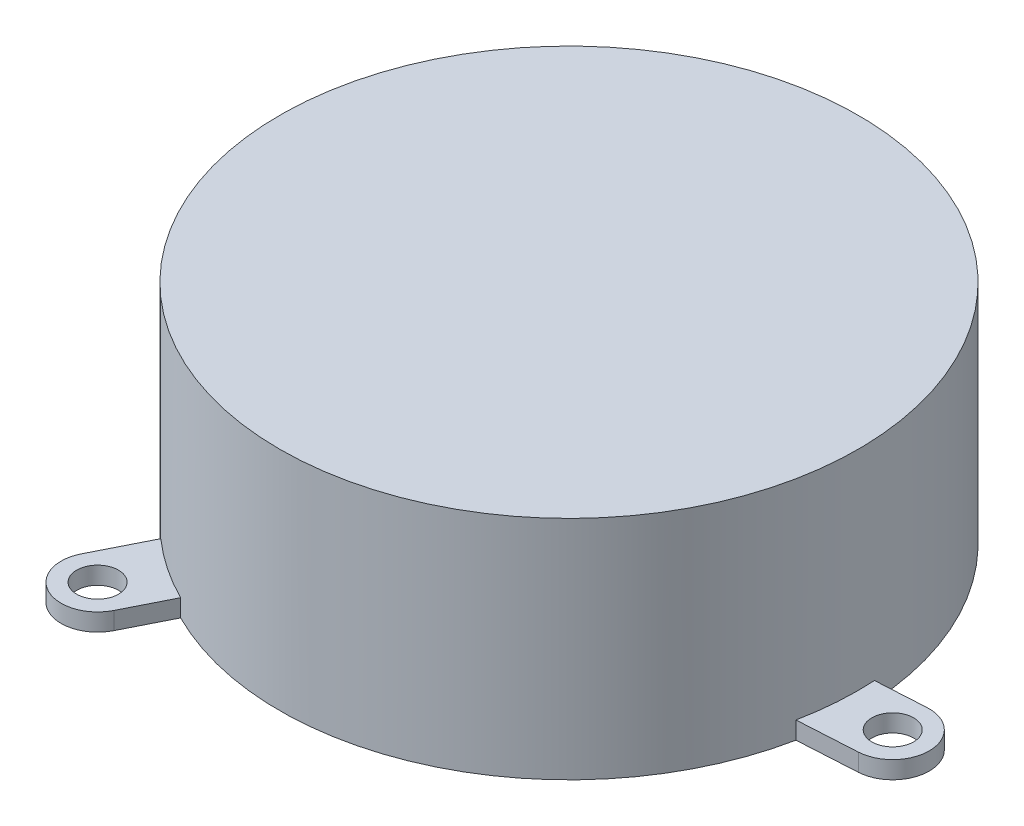
ISO-10303-21;
HEADER;
FILE_DESCRIPTION(('STEP AP214'),'2;1');
FILE_NAME('part.step','',(''),(''),'','','');
FILE_SCHEMA(('AUTOMOTIVE_DESIGN { 1 0 10303 214 1 1 1 1 }'));
ENDSEC;
DATA;
#1=APPLICATION_CONTEXT('core data for automotive mechanical design processes');
#2=APPLICATION_PROTOCOL_DEFINITION('international standard','automotive_design',2000,#1);
#3=PRODUCT_CONTEXT('',#1,'mechanical');
#4=PRODUCT('Part','Part','',(#3));
#5=PRODUCT_RELATED_PRODUCT_CATEGORY('part','',(#4));
#6=PRODUCT_DEFINITION_FORMATION('','',#4);
#7=PRODUCT_DEFINITION_CONTEXT('part definition',#1,'design');
#8=PRODUCT_DEFINITION('design','',#6,#7);
#9=PRODUCT_DEFINITION_SHAPE('','',#8);
#10=(LENGTH_UNIT() NAMED_UNIT(*) SI_UNIT(.MILLI.,.METRE.));
#11=(NAMED_UNIT(*) PLANE_ANGLE_UNIT() SI_UNIT($,.RADIAN.));
#12=(NAMED_UNIT(*) SI_UNIT($,.STERADIAN.) SOLID_ANGLE_UNIT());
#13=UNCERTAINTY_MEASURE_WITH_UNIT(LENGTH_MEASURE(1.E-05),#10,'distance_accuracy_value','');
#14=(GEOMETRIC_REPRESENTATION_CONTEXT(3) GLOBAL_UNCERTAINTY_ASSIGNED_CONTEXT((#13)) GLOBAL_UNIT_ASSIGNED_CONTEXT((#10,
#11,#12)) REPRESENTATION_CONTEXT('',''));
#15=CARTESIAN_POINT('',(0.,0.,0.));
#16=DIRECTION('',(0.,0.,1.));
#17=DIRECTION('',(1.,0.,0.));
#18=AXIS2_PLACEMENT_3D('',#15,#16,#17);
#19=CARTESIAN_POINT('',(0.,16.8,0.));
#20=DIRECTION('',(0.,-1.,0.));
#21=DIRECTION('',(0.,0.,-1.));
#22=AXIS2_PLACEMENT_3D('',#19,#20,#21);
#23=CYLINDRICAL_SURFACE('',#22,21.463);
#24=CARTESIAN_POINT('',(0.,0.,0.));
#25=DIRECTION('',(0.,1.,0.));
#26=DIRECTION('',(0.,0.,1.));
#27=AXIS2_PLACEMENT_3D('',#24,#25,#26);
#28=CIRCLE('',#27,21.463);
#29=CARTESIAN_POINT('',(-9.63856211988346,0.,19.1770302513488));
#30=VERTEX_POINT('',#29);
#31=CARTESIAN_POINT('',(21.0464671028523,0.,4.20792009056212));
#32=VERTEX_POINT('',#31);
#33=EDGE_CURVE('E37',#30,#32,#28,.T.);
#34=ORIENTED_EDGE('',*,*,#33,.T.);
#35=DIRECTION('',(0.,-1.,0.));
#36=VECTOR('',#35,1.);
#37=CARTESIAN_POINT('',(21.0464671028523,1.3,4.20792009056212));
#38=LINE('',#37,#36);
#39=CARTESIAN_POINT('',(21.0464671028523,1.3,4.20792009056212));
#40=VERTEX_POINT('',#39);
#41=EDGE_CURVE('E53',#40,#32,#38,.T.);
#42=ORIENTED_EDGE('',*,*,#41,.F.);
#43=CARTESIAN_POINT('',(0.,1.3,0.));
#44=DIRECTION('',(0.,1.,0.));
#45=DIRECTION('',(0.866025403784443,0.,-0.499999999999992));
#46=AXIS2_PLACEMENT_3D('',#43,#44,#45);
#47=CIRCLE('',#46,21.463);
#48=CARTESIAN_POINT('',(21.4270764267525,1.3,-1.24127547390075));
#49=VERTEX_POINT('',#48);
#50=EDGE_CURVE('E48',#40,#49,#47,.T.);
#51=ORIENTED_EDGE('',*,*,#50,.T.);
#52=DIRECTION('',(0.,-1.,0.));
#53=VECTOR('',#52,1.);
#54=CARTESIAN_POINT('',(21.4270764267525,1.3,-1.24127547390075));
#55=LINE('',#54,#53);
#56=CARTESIAN_POINT('',(21.4270764267525,0.,-1.24127547390075));
#57=VERTEX_POINT('',#56);
#58=EDGE_CURVE('E133',#49,#57,#55,.T.);
#59=ORIENTED_EDGE('',*,*,#58,.T.);
#60=CARTESIAN_POINT('',(-6.87906785590453,0.,-20.3307352162646));
#61=VERTEX_POINT('',#60);
#62=EDGE_CURVE('E243',#57,#61,#28,.T.);
#63=ORIENTED_EDGE('',*,*,#62,.T.);
#64=DIRECTION('',(0.,-1.,0.));
#65=VECTOR('',#64,1.);
#66=CARTESIAN_POINT('',(-6.87906785590453,1.3,-20.3307352162646));
#67=LINE('',#66,#65);
#68=CARTESIAN_POINT('',(-6.87906785590453,1.3,-20.3307352162646));
#69=VERTEX_POINT('',#68);
#70=EDGE_CURVE('E185',#69,#61,#67,.T.);
#71=ORIENTED_EDGE('',*,*,#70,.F.);
#72=CARTESIAN_POINT('',(0.,1.3,0.));
#73=DIRECTION('',(0.,1.,0.));
#74=DIRECTION('',(-0.866025403784436,0.,-0.500000000000004));
#75=AXIS2_PLACEMENT_3D('',#72,#73,#74);
#76=CIRCLE('',#75,21.463);
#77=CARTESIAN_POINT('',(-11.7885143068689,1.3,-17.9357547774479));
#78=VERTEX_POINT('',#77);
#79=EDGE_CURVE('E165',#69,#78,#76,.T.);
#80=ORIENTED_EDGE('',*,*,#79,.T.);
#81=DIRECTION('',(0.,-1.,0.));
#82=VECTOR('',#81,1.);
#83=CARTESIAN_POINT('',(-11.7885143068689,1.3,-17.9357547774479));
#84=LINE('',#83,#82);
#85=CARTESIAN_POINT('',(-11.7885143068689,0.,-17.9357547774479));
#86=VERTEX_POINT('',#85);
#87=EDGE_CURVE('E177',#78,#86,#84,.T.);
#88=ORIENTED_EDGE('',*,*,#87,.T.);
#89=CARTESIAN_POINT('',(-14.1673992469477,0.,16.1228151257026));
#90=VERTEX_POINT('',#89);
#91=EDGE_CURVE('E224',#86,#90,#28,.T.);
#92=ORIENTED_EDGE('',*,*,#91,.T.);
#93=DIRECTION('',(0.,-1.,0.));
#94=VECTOR('',#93,1.);
#95=CARTESIAN_POINT('',(-14.1673992469477,1.3,16.1228151257026));
#96=LINE('',#95,#94);
#97=CARTESIAN_POINT('',(-14.1673992469477,1.3,16.1228151257026));
#98=VERTEX_POINT('',#97);
#99=EDGE_CURVE('E221',#98,#90,#96,.T.);
#100=ORIENTED_EDGE('',*,*,#99,.F.);
#101=CARTESIAN_POINT('',(0.,1.3,0.));
#102=DIRECTION('',(0.,1.,0.));
#103=DIRECTION('',(0.,0.,1.));
#104=AXIS2_PLACEMENT_3D('',#101,#102,#103);
#105=CIRCLE('',#104,21.463);
#106=CARTESIAN_POINT('',(-9.63856211988345,1.3,19.1770302513488));
#107=VERTEX_POINT('',#106);
#108=EDGE_CURVE('E201',#98,#107,#105,.T.);
#109=ORIENTED_EDGE('',*,*,#108,.T.);
#110=DIRECTION('',(0.,-1.,0.));
#111=VECTOR('',#110,1.);
#112=CARTESIAN_POINT('',(-9.63856211988346,1.3,19.1770302513488));
#113=LINE('',#112,#111);
#114=EDGE_CURVE('E213',#107,#30,#113,.T.);
#115=ORIENTED_EDGE('',*,*,#114,.T.);
#116=EDGE_LOOP('',(#34,#42,#51,#59,#63,#71,#80,#88,#92,#100,#109,#115));
#117=FACE_BOUND('',#116,.T.);
#118=CARTESIAN_POINT('',(0.,16.8,0.));
#119=DIRECTION('',(0.,1.,0.));
#120=DIRECTION('',(0.,0.,1.));
#121=AXIS2_PLACEMENT_3D('',#118,#119,#120);
#122=CIRCLE('',#121,21.463);
#123=CARTESIAN_POINT('',(0.,16.8,21.463));
#124=VERTEX_POINT('',#123);
#125=EDGE_CURVE('E11',#124,#124,#122,.T.);
#126=ORIENTED_EDGE('',*,*,#125,.F.);
#127=EDGE_LOOP('',(#126));
#128=FACE_BOUND('',#127,.T.);
#129=ADVANCED_FACE('F34',(#117,#128),#23,.T.);
#130=CARTESIAN_POINT('',(0.,16.8,0.));
#131=DIRECTION('',(0.,1.,0.));
#132=DIRECTION('',(0.,0.,1.));
#133=AXIS2_PLACEMENT_3D('',#130,#131,#132);
#134=PLANE('',#133);
#135=ORIENTED_EDGE('',*,*,#125,.T.);
#136=EDGE_LOOP('',(#135));
#137=FACE_BOUND('',#136,.T.);
#138=ADVANCED_FACE('F263',(#137),#134,.T.);
#139=CARTESIAN_POINT('',(0.,0.,0.));
#140=DIRECTION('',(0.,1.,0.));
#141=DIRECTION('',(0.,0.,1.));
#142=AXIS2_PLACEMENT_3D('',#139,#140,#141);
#143=PLANE('',#142);
#144=ORIENTED_EDGE('',*,*,#33,.F.);
#145=DIRECTION('',(-0.449078046865931,0.,0.893492533725426));
#146=VECTOR('',#145,1.);
#147=CARTESIAN_POINT('',(-11.2963540619623,0.,22.4753983925994));
#148=LINE('',#147,#146);
#149=CARTESIAN_POINT('',(-11.2963540619623,0.,22.4753983925994));
#150=VERTEX_POINT('',#149);
#151=EDGE_CURVE('E198',#30,#150,#148,.T.);
#152=ORIENTED_EDGE('',*,*,#151,.T.);
#153=CARTESIAN_POINT('',(-13.7168535357105,0.,21.2588317901024));
#154=DIRECTION('',(0.,-1.,0.));
#155=DIRECTION('',(0.,0.,1.));
#156=AXIS2_PLACEMENT_3D('',#153,#154,#155);
#157=CIRCLE('',#156,2.70903156141199);
#158=CARTESIAN_POINT('',(-16.1373530094586,0.,20.0422651876053));
#159=VERTEX_POINT('',#158);
#160=EDGE_CURVE('E216',#150,#159,#157,.T.);
#161=ORIENTED_EDGE('',*,*,#160,.T.);
#162=DIRECTION('',(0.449078046865931,0.,-0.893492533725426));
#163=VECTOR('',#162,1.);
#164=CARTESIAN_POINT('',(-14.1673992469477,0.,16.1228151257026));
#165=LINE('',#164,#163);
#166=EDGE_CURVE('E204',#159,#90,#165,.T.);
#167=ORIENTED_EDGE('',*,*,#166,.T.);
#168=ORIENTED_EDGE('',*,*,#91,.F.);
#169=DIRECTION('',(-0.549248208864973,0.,-0.83565926373051));
#170=VECTOR('',#169,1.);
#171=CARTESIAN_POINT('',(-13.8160889371858,0.,-21.0206287841027));
#172=LINE('',#171,#170);
#173=CARTESIAN_POINT('',(-13.8160889371858,0.,-21.0206287841027));
#174=VERTEX_POINT('',#173);
#175=EDGE_CURVE('E162',#86,#174,#172,.T.);
#176=ORIENTED_EDGE('',*,*,#175,.T.);
#177=CARTESIAN_POINT('',(-11.5522616171535,0.,-22.5085595169669));
#178=DIRECTION('',(0.,-1.,0.));
#179=DIRECTION('',(-0.866025403784436,0.,-0.500000000000004));
#180=AXIS2_PLACEMENT_3D('',#177,#178,#179);
#181=CIRCLE('',#180,2.70903156141199);
#182=CARTESIAN_POINT('',(-9.28843429712128,0.,-23.9964902498311));
#183=VERTEX_POINT('',#182);
#184=EDGE_CURVE('E180',#174,#183,#181,.T.);
#185=ORIENTED_EDGE('',*,*,#184,.T.);
#186=DIRECTION('',(0.549248208864974,0.,0.83565926373051));
#187=VECTOR('',#186,1.);
#188=CARTESIAN_POINT('',(-6.87906785590453,0.,-20.3307352162646));
#189=LINE('',#188,#187);
#190=EDGE_CURVE('E168',#183,#61,#189,.T.);
#191=ORIENTED_EDGE('',*,*,#190,.T.);
#192=ORIENTED_EDGE('',*,*,#62,.F.);
#193=DIRECTION('',(0.998326255730909,0.,-0.0578332699949085));
#194=VECTOR('',#193,1.);
#195=CARTESIAN_POINT('',(25.1124429991482,0.,-1.45476960849658));
#196=LINE('',#195,#194);
#197=CARTESIAN_POINT('',(25.1124429991482,0.,-1.45476960849658));
#198=VERTEX_POINT('',#197);
#199=EDGE_CURVE('E149',#57,#198,#196,.T.);
#200=ORIENTED_EDGE('',*,*,#199,.T.);
#201=CARTESIAN_POINT('',(25.2691151528641,0.,1.24972772686471));
#202=DIRECTION('',(0.,-1.,0.));
#203=DIRECTION('',(0.866025403784443,0.,-0.499999999999992));
#204=AXIS2_PLACEMENT_3D('',#201,#202,#203);
#205=CIRCLE('',#204,2.70903156141199);
#206=CARTESIAN_POINT('',(25.42578730658,0.,3.954225062226));
#207=VERTEX_POINT('',#206);
#208=EDGE_CURVE('E127',#198,#207,#205,.T.);
#209=ORIENTED_EDGE('',*,*,#208,.T.);
#210=DIRECTION('',(-0.998326255730909,0.,0.057833269994909));
#211=VECTOR('',#210,1.);
#212=CARTESIAN_POINT('',(21.0464671028523,0.,4.20792009056212));
#213=LINE('',#212,#211);
#214=EDGE_CURVE('E144',#207,#32,#213,.T.);
#215=ORIENTED_EDGE('',*,*,#214,.T.);
#216=EDGE_LOOP('',(#144,#152,#161,#167,#168,#176,#185,#191,#192,#200,#209,#215));
#217=FACE_BOUND('',#216,.T.);
#218=CARTESIAN_POINT('',(-13.7168535357105,0.,21.2588317901024));
#219=DIRECTION('',(0.,-1.,0.));
#220=DIRECTION('',(0.,0.,-1.));
#221=AXIS2_PLACEMENT_3D('',#218,#219,#220);
#222=CIRCLE('',#221,1.55);
#223=CARTESIAN_POINT('',(-13.7168535357105,0.,19.7088317901024));
#224=VERTEX_POINT('',#223);
#225=EDGE_CURVE('E188',#224,#224,#222,.T.);
#226=ORIENTED_EDGE('',*,*,#225,.F.);
#227=EDGE_LOOP('',(#226));
#228=FACE_BOUND('',#227,.T.);
#229=CARTESIAN_POINT('',(-11.5522616171535,0.,-22.5085595169669));
#230=DIRECTION('',(0.,-1.,0.));
#231=DIRECTION('',(0.866025403784436,0.,0.500000000000004));
#232=AXIS2_PLACEMENT_3D('',#229,#230,#231);
#233=CIRCLE('',#232,1.55);
#234=CARTESIAN_POINT('',(-10.2099222412877,0.,-21.7335595169669));
#235=VERTEX_POINT('',#234);
#236=EDGE_CURVE('E156',#235,#235,#233,.T.);
#237=ORIENTED_EDGE('',*,*,#236,.F.);
#238=EDGE_LOOP('',(#237));
#239=FACE_BOUND('',#238,.T.);
#240=CARTESIAN_POINT('',(25.2691151528641,0.,1.24972772686471));
#241=DIRECTION('',(0.,-1.,0.));
#242=DIRECTION('',(-0.866025403784443,0.,0.499999999999992));
#243=AXIS2_PLACEMENT_3D('',#240,#241,#242);
#244=CIRCLE('',#243,1.55);
#245=CARTESIAN_POINT('',(23.9267757769982,0.,2.0247277268647));
#246=VERTEX_POINT('',#245);
#247=EDGE_CURVE('E428',#246,#246,#244,.T.);
#248=ORIENTED_EDGE('',*,*,#247,.F.);
#249=EDGE_LOOP('',(#248));
#250=FACE_BOUND('',#249,.T.);
#251=ADVANCED_FACE('F239',(#217,#228,#239,#250),#143,.F.);
#252=CARTESIAN_POINT('',(-14.1673992469477,1.3,16.1228151257026));
#253=DIRECTION('',(-0.893492533725426,0.,-0.449078046865931));
#254=DIRECTION('',(-0.449078046865931,0.,0.893492533725426));
#255=AXIS2_PLACEMENT_3D('',#252,#253,#254);
#256=PLANE('',#255);
#257=ORIENTED_EDGE('',*,*,#166,.F.);
#258=DIRECTION('',(0.,-1.,0.));
#259=VECTOR('',#258,1.);
#260=CARTESIAN_POINT('',(-16.1373530094586,1.3,20.0422651876053));
#261=LINE('',#260,#259);
#262=CARTESIAN_POINT('',(-16.1373530094586,1.3,20.0422651876053));
#263=VERTEX_POINT('',#262);
#264=EDGE_CURVE('E225',#263,#159,#261,.T.);
#265=ORIENTED_EDGE('',*,*,#264,.F.);
#266=DIRECTION('',(0.449078046865931,0.,-0.893492533725426));
#267=VECTOR('',#266,1.);
#268=CARTESIAN_POINT('',(-14.1673992469477,1.3,16.1228151257026));
#269=LINE('',#268,#267);
#270=EDGE_CURVE('E210',#263,#98,#269,.T.);
#271=ORIENTED_EDGE('',*,*,#270,.T.);
#272=ORIENTED_EDGE('',*,*,#99,.T.);
#273=EDGE_LOOP('',(#257,#265,#271,#272));
#274=FACE_BOUND('',#273,.T.);
#275=ADVANCED_FACE('F247',(#274),#256,.T.);
#276=CARTESIAN_POINT('',(-13.7168535357105,1.3,21.2588317901024));
#277=DIRECTION('',(0.,-1.,0.));
#278=DIRECTION('',(0.,0.,-1.));
#279=AXIS2_PLACEMENT_3D('',#276,#277,#278);
#280=CYLINDRICAL_SURFACE('',#279,2.70903156141199);
#281=ORIENTED_EDGE('',*,*,#160,.F.);
#282=DIRECTION('',(0.,-1.,0.));
#283=VECTOR('',#282,1.);
#284=CARTESIAN_POINT('',(-11.2963540619623,1.3,22.4753983925994));
#285=LINE('',#284,#283);
#286=CARTESIAN_POINT('',(-11.2963540619623,1.3,22.4753983925994));
#287=VERTEX_POINT('',#286);
#288=EDGE_CURVE('E227',#287,#150,#285,.T.);
#289=ORIENTED_EDGE('',*,*,#288,.F.);
#290=CARTESIAN_POINT('',(-13.7168535357105,1.3,21.2588317901024));
#291=DIRECTION('',(0.,-1.,0.));
#292=DIRECTION('',(0.,0.,1.));
#293=AXIS2_PLACEMENT_3D('',#290,#291,#292);
#294=CIRCLE('',#293,2.70903156141199);
#295=EDGE_CURVE('E207',#287,#263,#294,.T.);
#296=ORIENTED_EDGE('',*,*,#295,.T.);
#297=ORIENTED_EDGE('',*,*,#264,.T.);
#298=EDGE_LOOP('',(#281,#289,#296,#297));
#299=FACE_BOUND('',#298,.T.);
#300=ADVANCED_FACE('F253',(#299),#280,.T.);
#301=CARTESIAN_POINT('',(-11.2963540619623,1.3,22.4753983925994));
#302=DIRECTION('',(0.893492533725426,0.,0.449078046865931));
#303=DIRECTION('',(0.449078046865931,0.,-0.893492533725426));
#304=AXIS2_PLACEMENT_3D('',#301,#302,#303);
#305=PLANE('',#304);
#306=ORIENTED_EDGE('',*,*,#151,.F.);
#307=ORIENTED_EDGE('',*,*,#114,.F.);
#308=DIRECTION('',(-0.449078046865931,0.,0.893492533725426));
#309=VECTOR('',#308,1.);
#310=CARTESIAN_POINT('',(-11.2963540619623,1.3,22.4753983925994));
#311=LINE('',#310,#309);
#312=EDGE_CURVE('E203',#107,#287,#311,.T.);
#313=ORIENTED_EDGE('',*,*,#312,.T.);
#314=ORIENTED_EDGE('',*,*,#288,.T.);
#315=EDGE_LOOP('',(#306,#307,#313,#314));
#316=FACE_BOUND('',#315,.T.);
#317=ADVANCED_FACE('F236',(#316),#305,.T.);
#318=CARTESIAN_POINT('',(0.,1.3,0.));
#319=DIRECTION('',(0.,1.,0.));
#320=DIRECTION('',(0.,0.,1.));
#321=AXIS2_PLACEMENT_3D('',#318,#319,#320);
#322=PLANE('',#321);
#323=CARTESIAN_POINT('',(-13.7168535357105,1.3,21.2588317901024));
#324=DIRECTION('',(0.,-1.,0.));
#325=DIRECTION('',(0.,0.,-1.));
#326=AXIS2_PLACEMENT_3D('',#323,#324,#325);
#327=CIRCLE('',#326,1.55);
#328=CARTESIAN_POINT('',(-13.7168535357105,1.3,19.7088317901024));
#329=VERTEX_POINT('',#328);
#330=EDGE_CURVE('E195',#329,#329,#327,.T.);
#331=ORIENTED_EDGE('',*,*,#330,.T.);
#332=EDGE_LOOP('',(#331));
#333=FACE_BOUND('',#332,.T.);
#334=ORIENTED_EDGE('',*,*,#108,.F.);
#335=ORIENTED_EDGE('',*,*,#270,.F.);
#336=ORIENTED_EDGE('',*,*,#295,.F.);
#337=ORIENTED_EDGE('',*,*,#312,.F.);
#338=EDGE_LOOP('',(#334,#335,#336,#337));
#339=FACE_BOUND('',#338,.T.);
#340=ADVANCED_FACE('F251',(#333,#339),#322,.T.);
#341=CARTESIAN_POINT('',(-13.7168535357105,1.3,21.2588317901024));
#342=DIRECTION('',(0.,-1.,0.));
#343=DIRECTION('',(0.,0.,-1.));
#344=AXIS2_PLACEMENT_3D('',#341,#342,#343);
#345=CYLINDRICAL_SURFACE('',#344,1.55);
#346=ORIENTED_EDGE('',*,*,#330,.F.);
#347=EDGE_LOOP('',(#346));
#348=FACE_BOUND('',#347,.T.);
#349=ORIENTED_EDGE('',*,*,#225,.T.);
#350=EDGE_LOOP('',(#349));
#351=FACE_BOUND('',#350,.T.);
#352=ADVANCED_FACE('F302',(#348,#351),#345,.F.);
#353=CARTESIAN_POINT('',(-6.87906785590453,1.3,-20.3307352162646));
#354=DIRECTION('',(0.83565926373051,0.,-0.549248208864974));
#355=DIRECTION('',(-0.549248208864974,0.,-0.83565926373051));
#356=AXIS2_PLACEMENT_3D('',#353,#354,#355);
#357=PLANE('',#356);
#358=ORIENTED_EDGE('',*,*,#190,.F.);
#359=DIRECTION('',(0.,-1.,0.));
#360=VECTOR('',#359,1.);
#361=CARTESIAN_POINT('',(-9.28843429712128,1.3,-23.9964902498311));
#362=LINE('',#361,#360);
#363=CARTESIAN_POINT('',(-9.28843429712128,1.3,-23.9964902498311));
#364=VERTEX_POINT('',#363);
#365=EDGE_CURVE('E189',#364,#183,#362,.T.);
#366=ORIENTED_EDGE('',*,*,#365,.F.);
#367=DIRECTION('',(0.549248208864974,0.,0.83565926373051));
#368=VECTOR('',#367,1.);
#369=CARTESIAN_POINT('',(-6.87906785590453,1.3,-20.3307352162646));
#370=LINE('',#369,#368);
#371=EDGE_CURVE('E174',#364,#69,#370,.T.);
#372=ORIENTED_EDGE('',*,*,#371,.T.);
#373=ORIENTED_EDGE('',*,*,#70,.T.);
#374=EDGE_LOOP('',(#358,#366,#372,#373));
#375=FACE_BOUND('',#374,.T.);
#376=ADVANCED_FACE('F311',(#375),#357,.T.);
#377=CARTESIAN_POINT('',(-11.5522616171535,1.3,-22.5085595169669));
#378=DIRECTION('',(0.,-1.,0.));
#379=DIRECTION('',(0.,0.,-1.));
#380=AXIS2_PLACEMENT_3D('',#377,#378,#379);
#381=CYLINDRICAL_SURFACE('',#380,2.70903156141199);
#382=ORIENTED_EDGE('',*,*,#184,.F.);
#383=DIRECTION('',(0.,-1.,0.));
#384=VECTOR('',#383,1.);
#385=CARTESIAN_POINT('',(-13.8160889371858,1.3,-21.0206287841027));
#386=LINE('',#385,#384);
#387=CARTESIAN_POINT('',(-13.8160889371858,1.3,-21.0206287841027));
#388=VERTEX_POINT('',#387);
#389=EDGE_CURVE('E191',#388,#174,#386,.T.);
#390=ORIENTED_EDGE('',*,*,#389,.F.);
#391=CARTESIAN_POINT('',(-11.5522616171535,1.3,-22.5085595169669));
#392=DIRECTION('',(0.,-1.,0.));
#393=DIRECTION('',(-0.866025403784436,0.,-0.500000000000004));
#394=AXIS2_PLACEMENT_3D('',#391,#392,#393);
#395=CIRCLE('',#394,2.70903156141199);
#396=EDGE_CURVE('E171',#388,#364,#395,.T.);
#397=ORIENTED_EDGE('',*,*,#396,.T.);
#398=ORIENTED_EDGE('',*,*,#365,.T.);
#399=EDGE_LOOP('',(#382,#390,#397,#398));
#400=FACE_BOUND('',#399,.T.);
#401=ADVANCED_FACE('F335',(#400),#381,.T.);
#402=CARTESIAN_POINT('',(-13.8160889371858,1.3,-21.0206287841027));
#403=DIRECTION('',(-0.83565926373051,0.,0.549248208864973));
#404=DIRECTION('',(0.549248208864973,0.,0.83565926373051));
#405=AXIS2_PLACEMENT_3D('',#402,#403,#404);
#406=PLANE('',#405);
#407=ORIENTED_EDGE('',*,*,#175,.F.);
#408=ORIENTED_EDGE('',*,*,#87,.F.);
#409=DIRECTION('',(-0.549248208864973,0.,-0.83565926373051));
#410=VECTOR('',#409,1.);
#411=CARTESIAN_POINT('',(-13.8160889371858,1.3,-21.0206287841027));
#412=LINE('',#411,#410);
#413=EDGE_CURVE('E167',#78,#388,#412,.T.);
#414=ORIENTED_EDGE('',*,*,#413,.T.);
#415=ORIENTED_EDGE('',*,*,#389,.T.);
#416=EDGE_LOOP('',(#407,#408,#414,#415));
#417=FACE_BOUND('',#416,.T.);
#418=ADVANCED_FACE('F344',(#417),#406,.T.);
#419=CARTESIAN_POINT('',(0.,1.3,0.));
#420=DIRECTION('',(0.,1.,0.));
#421=DIRECTION('',(-0.866025403784436,0.,-0.500000000000004));
#422=AXIS2_PLACEMENT_3D('',#419,#420,#421);
#423=PLANE('',#422);
#424=CARTESIAN_POINT('',(-11.5522616171535,1.3,-22.5085595169669));
#425=DIRECTION('',(0.,-1.,0.));
#426=DIRECTION('',(0.866025403784436,0.,0.500000000000004));
#427=AXIS2_PLACEMENT_3D('',#424,#425,#426);
#428=CIRCLE('',#427,1.55);
#429=CARTESIAN_POINT('',(-10.2099222412877,1.3,-21.7335595169669));
#430=VERTEX_POINT('',#429);
#431=EDGE_CURVE('E159',#430,#430,#428,.T.);
#432=ORIENTED_EDGE('',*,*,#431,.T.);
#433=EDGE_LOOP('',(#432));
#434=FACE_BOUND('',#433,.T.);
#435=ORIENTED_EDGE('',*,*,#79,.F.);
#436=ORIENTED_EDGE('',*,*,#371,.F.);
#437=ORIENTED_EDGE('',*,*,#396,.F.);
#438=ORIENTED_EDGE('',*,*,#413,.F.);
#439=EDGE_LOOP('',(#435,#436,#437,#438));
#440=FACE_BOUND('',#439,.T.);
#441=ADVANCED_FACE('F353',(#434,#440),#423,.T.);
#442=CARTESIAN_POINT('',(-11.5522616171535,1.3,-22.5085595169669));
#443=DIRECTION('',(0.,-1.,0.));
#444=DIRECTION('',(0.,0.,-1.));
#445=AXIS2_PLACEMENT_3D('',#442,#443,#444);
#446=CYLINDRICAL_SURFACE('',#445,1.55);
#447=ORIENTED_EDGE('',*,*,#431,.F.);
#448=EDGE_LOOP('',(#447));
#449=FACE_BOUND('',#448,.T.);
#450=ORIENTED_EDGE('',*,*,#236,.T.);
#451=EDGE_LOOP('',(#450));
#452=FACE_BOUND('',#451,.T.);
#453=ADVANCED_FACE('F362',(#449,#452),#446,.F.);
#454=CARTESIAN_POINT('',(21.0464671028523,1.3,4.20792009056212));
#455=DIRECTION('',(0.057833269994909,0.,0.998326255730909));
#456=DIRECTION('',(0.998326255730909,0.,-0.057833269994909));
#457=AXIS2_PLACEMENT_3D('',#454,#455,#456);
#458=PLANE('',#457);
#459=ORIENTED_EDGE('',*,*,#214,.F.);
#460=DIRECTION('',(0.,-1.,0.));
#461=VECTOR('',#460,1.);
#462=CARTESIAN_POINT('',(25.42578730658,1.3,3.954225062226));
#463=LINE('',#462,#461);
#464=CARTESIAN_POINT('',(25.42578730658,1.3,3.954225062226));
#465=VERTEX_POINT('',#464);
#466=EDGE_CURVE('E132',#465,#207,#463,.T.);
#467=ORIENTED_EDGE('',*,*,#466,.F.);
#468=DIRECTION('',(-0.998326255730909,0.,0.057833269994909));
#469=VECTOR('',#468,1.);
#470=CARTESIAN_POINT('',(21.0464671028523,1.3,4.20792009056212));
#471=LINE('',#470,#469);
#472=EDGE_CURVE('E140',#465,#40,#471,.T.);
#473=ORIENTED_EDGE('',*,*,#472,.T.);
#474=ORIENTED_EDGE('',*,*,#41,.T.);
#475=EDGE_LOOP('',(#459,#467,#473,#474));
#476=FACE_BOUND('',#475,.T.);
#477=ADVANCED_FACE('F371',(#476),#458,.T.);
#478=CARTESIAN_POINT('',(25.2691151528641,1.3,1.24972772686471));
#479=DIRECTION('',(0.,-1.,0.));
#480=DIRECTION('',(0.,0.,-1.));
#481=AXIS2_PLACEMENT_3D('',#478,#479,#480);
#482=CYLINDRICAL_SURFACE('',#481,2.70903156141199);
#483=ORIENTED_EDGE('',*,*,#208,.F.);
#484=DIRECTION('',(0.,-1.,0.));
#485=VECTOR('',#484,1.);
#486=CARTESIAN_POINT('',(25.1124429991482,1.3,-1.45476960849658));
#487=LINE('',#486,#485);
#488=CARTESIAN_POINT('',(25.1124429991482,1.3,-1.45476960849658));
#489=VERTEX_POINT('',#488);
#490=EDGE_CURVE('E121',#489,#198,#487,.T.);
#491=ORIENTED_EDGE('',*,*,#490,.F.);
#492=CARTESIAN_POINT('',(25.2691151528641,1.3,1.24972772686471));
#493=DIRECTION('',(0.,-1.,0.));
#494=DIRECTION('',(0.866025403784443,0.,-0.499999999999992));
#495=AXIS2_PLACEMENT_3D('',#492,#493,#494);
#496=CIRCLE('',#495,2.70903156141199);
#497=EDGE_CURVE('E124',#489,#465,#496,.T.);
#498=ORIENTED_EDGE('',*,*,#497,.T.);
#499=ORIENTED_EDGE('',*,*,#466,.T.);
#500=EDGE_LOOP('',(#483,#491,#498,#499));
#501=FACE_BOUND('',#500,.T.);
#502=ADVANCED_FACE('F123',(#501),#482,.T.);
#503=CARTESIAN_POINT('',(25.1124429991482,1.3,-1.45476960849658));
#504=DIRECTION('',(-0.0578332699949085,0.,-0.998326255730909));
#505=DIRECTION('',(-0.998326255730909,0.,0.0578332699949085));
#506=AXIS2_PLACEMENT_3D('',#503,#504,#505);
#507=PLANE('',#506);
#508=ORIENTED_EDGE('',*,*,#199,.F.);
#509=ORIENTED_EDGE('',*,*,#58,.F.);
#510=DIRECTION('',(0.998326255730909,0.,-0.0578332699949085));
#511=VECTOR('',#510,1.);
#512=CARTESIAN_POINT('',(25.1124429991482,1.3,-1.45476960849658));
#513=LINE('',#512,#511);
#514=EDGE_CURVE('E138',#49,#489,#513,.T.);
#515=ORIENTED_EDGE('',*,*,#514,.T.);
#516=ORIENTED_EDGE('',*,*,#490,.T.);
#517=EDGE_LOOP('',(#508,#509,#515,#516));
#518=FACE_BOUND('',#517,.T.);
#519=ADVANCED_FACE('F142',(#518),#507,.T.);
#520=CARTESIAN_POINT('',(0.,1.3,0.));
#521=DIRECTION('',(0.,1.,0.));
#522=DIRECTION('',(0.866025403784443,0.,-0.499999999999992));
#523=AXIS2_PLACEMENT_3D('',#520,#521,#522);
#524=PLANE('',#523);
#525=CARTESIAN_POINT('',(25.2691151528641,1.3,1.24972772686471));
#526=DIRECTION('',(0.,-1.,0.));
#527=DIRECTION('',(-0.866025403784443,0.,0.499999999999992));
#528=AXIS2_PLACEMENT_3D('',#525,#526,#527);
#529=CIRCLE('',#528,1.55);
#530=CARTESIAN_POINT('',(23.9267757769982,1.3,2.0247277268647));
#531=VERTEX_POINT('',#530);
#532=EDGE_CURVE('E151',#531,#531,#529,.T.);
#533=ORIENTED_EDGE('',*,*,#532,.T.);
#534=EDGE_LOOP('',(#533));
#535=FACE_BOUND('',#534,.T.);
#536=ORIENTED_EDGE('',*,*,#50,.F.);
#537=ORIENTED_EDGE('',*,*,#472,.F.);
#538=ORIENTED_EDGE('',*,*,#497,.F.);
#539=ORIENTED_EDGE('',*,*,#514,.F.);
#540=EDGE_LOOP('',(#536,#537,#538,#539));
#541=FACE_BOUND('',#540,.T.);
#542=ADVANCED_FACE('F137',(#535,#541),#524,.T.);
#543=CARTESIAN_POINT('',(25.2691151528641,1.3,1.24972772686471));
#544=DIRECTION('',(0.,-1.,0.));
#545=DIRECTION('',(0.,0.,-1.));
#546=AXIS2_PLACEMENT_3D('',#543,#544,#545);
#547=CYLINDRICAL_SURFACE('',#546,1.55);
#548=ORIENTED_EDGE('',*,*,#532,.F.);
#549=EDGE_LOOP('',(#548));
#550=FACE_BOUND('',#549,.T.);
#551=ORIENTED_EDGE('',*,*,#247,.T.);
#552=EDGE_LOOP('',(#551));
#553=FACE_BOUND('',#552,.T.);
#554=ADVANCED_FACE('F402',(#550,#553),#547,.F.);
#555=CLOSED_SHELL('',(#129,#138,#251,#275,#300,#317,#340,#352,#376,#401,#418,#441,#453,#477,
#502,#519,#542,#554));
#556=MANIFOLD_SOLID_BREP('B2',#555);
#557=ADVANCED_BREP_SHAPE_REPRESENTATION('',(#18,#556),#14);
#558=SHAPE_DEFINITION_REPRESENTATION(#9,#557);
ENDSEC;
END-ISO-10303-21;
